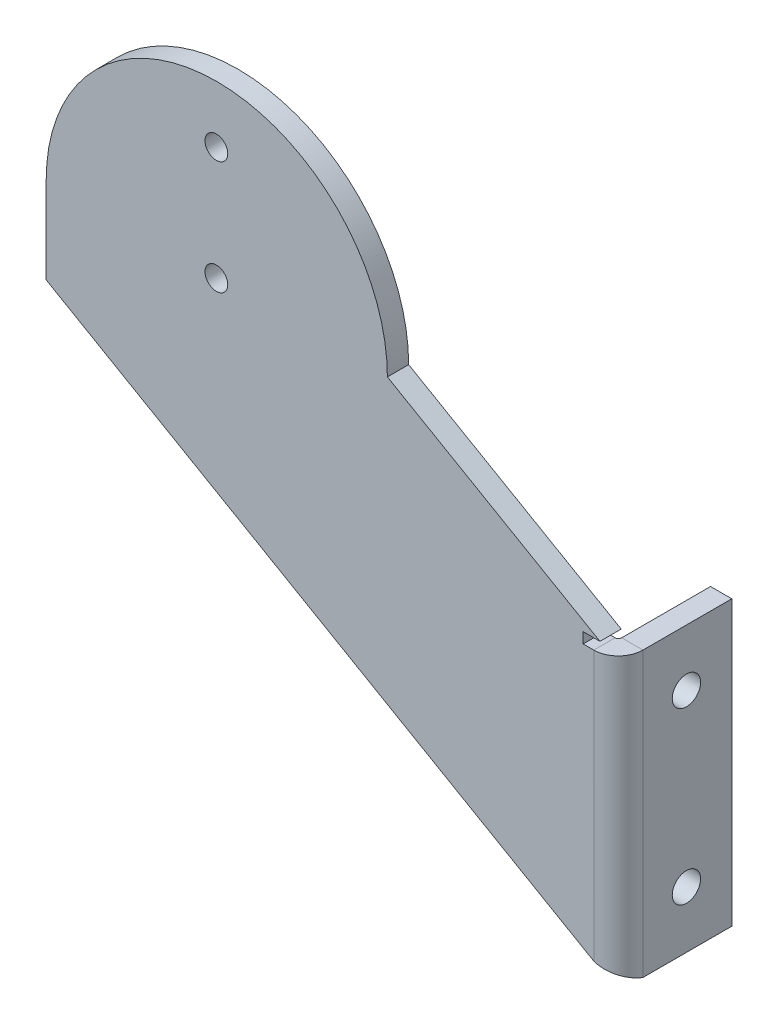
ISO-10303-21;
HEADER;
FILE_DESCRIPTION(('STEP AP214'),'2;1');
FILE_NAME('part.step','',(''),(''),'','','');
FILE_SCHEMA(('AUTOMOTIVE_DESIGN { 1 0 10303 214 1 1 1 1 }'));
ENDSEC;
DATA;
#1=APPLICATION_CONTEXT('core data for automotive mechanical design processes');
#2=APPLICATION_PROTOCOL_DEFINITION('international standard','automotive_design',2000,#1);
#3=PRODUCT_CONTEXT('',#1,'mechanical');
#4=PRODUCT('Part','Part','',(#3));
#5=PRODUCT_RELATED_PRODUCT_CATEGORY('part','',(#4));
#6=PRODUCT_DEFINITION_FORMATION('','',#4);
#7=PRODUCT_DEFINITION_CONTEXT('part definition',#1,'design');
#8=PRODUCT_DEFINITION('design','',#6,#7);
#9=PRODUCT_DEFINITION_SHAPE('','',#8);
#10=(LENGTH_UNIT() NAMED_UNIT(*) SI_UNIT(.MILLI.,.METRE.));
#11=(NAMED_UNIT(*) PLANE_ANGLE_UNIT() SI_UNIT($,.RADIAN.));
#12=(NAMED_UNIT(*) SI_UNIT($,.STERADIAN.) SOLID_ANGLE_UNIT());
#13=UNCERTAINTY_MEASURE_WITH_UNIT(LENGTH_MEASURE(1.E-05),#10,'distance_accuracy_value','');
#14=(GEOMETRIC_REPRESENTATION_CONTEXT(3) GLOBAL_UNCERTAINTY_ASSIGNED_CONTEXT((#13)) GLOBAL_UNIT_ASSIGNED_CONTEXT((#10,
#11,#12)) REPRESENTATION_CONTEXT('',''));
#15=CARTESIAN_POINT('',(0.,0.,0.));
#16=DIRECTION('',(0.,0.,1.));
#17=DIRECTION('',(1.,0.,0.));
#18=AXIS2_PLACEMENT_3D('',#15,#16,#17);
#19=CARTESIAN_POINT('',(0.,0.,-4.7625));
#20=DIRECTION('',(0.499999999999998,0.86602540378444,0.));
#21=DIRECTION('',(-0.86602540378444,0.499999999999998,0.));
#22=AXIS2_PLACEMENT_3D('',#19,#20,#21);
#23=PLANE('',#22);
#24=DIRECTION('',(-0.86602540378444,0.499999999999998,0.));
#25=VECTOR('',#24,1.);
#26=CARTESIAN_POINT('',(0.,0.,0.));
#27=LINE('',#26,#25);
#28=CARTESIAN_POINT('',(47.5931888885804,-27.4779404164144,0.));
#29=VERTEX_POINT('',#28);
#30=CARTESIAN_POINT('',(0.,0.,0.));
#31=VERTEX_POINT('',#30);
#32=EDGE_CURVE('E102',#29,#31,#27,.T.);
#33=ORIENTED_EDGE('',*,*,#32,.F.);
#34=DIRECTION('',(0.,0.,1.));
#35=VECTOR('',#34,1.);
#36=CARTESIAN_POINT('',(47.5931888885804,-27.4779404164144,-4.76250000000001));
#37=LINE('',#36,#35);
#38=CARTESIAN_POINT('',(47.5931888885804,-27.4779404164144,-4.76250000000001));
#39=VERTEX_POINT('',#38);
#40=EDGE_CURVE('E76',#39,#29,#37,.T.);
#41=ORIENTED_EDGE('',*,*,#40,.F.);
#42=DIRECTION('',(-0.86602540378444,0.499999999999998,0.));
#43=VECTOR('',#42,1.);
#44=CARTESIAN_POINT('',(0.,0.,-4.7625));
#45=LINE('',#44,#43);
#46=CARTESIAN_POINT('',(0.,0.,-4.7625));
#47=VERTEX_POINT('',#46);
#48=EDGE_CURVE('E84',#39,#47,#45,.T.);
#49=ORIENTED_EDGE('',*,*,#48,.T.);
#50=DIRECTION('',(0.,0.,1.));
#51=VECTOR('',#50,1.);
#52=CARTESIAN_POINT('',(0.,0.,-4.7625));
#53=LINE('',#52,#51);
#54=EDGE_CURVE('E301',#47,#31,#53,.T.);
#55=ORIENTED_EDGE('',*,*,#54,.T.);
#56=EDGE_LOOP('',(#33,#41,#49,#55));
#57=FACE_BOUND('',#56,.T.);
#58=ADVANCED_FACE('F61',(#57),#23,.T.);
#59=CARTESIAN_POINT('',(51.7176348741038,-93.3591904164144,-4.7625));
#60=DIRECTION('',(-0.500000000000004,-0.866025403784436,0.));
#61=DIRECTION('',(0.866025403784436,-0.500000000000004,0.));
#62=AXIS2_PLACEMENT_3D('',#59,#60,#61);
#63=PLANE('',#62);
#64=DIRECTION('',(0.866025403784436,-0.500000000000004,0.));
#65=VECTOR('',#64,1.);
#66=CARTESIAN_POINT('',(51.7176348741038,-93.3591904164144,-4.7625));
#67=LINE('',#66,#65);
#68=CARTESIAN_POINT('',(-76.3967302517925,-19.3923272239194,-4.7625));
#69=VERTEX_POINT('',#68);
#70=CARTESIAN_POINT('',(46.2185348741038,-90.1842835511137,-4.76250000000001));
#71=VERTEX_POINT('',#70);
#72=EDGE_CURVE('E338',#69,#71,#67,.T.);
#73=ORIENTED_EDGE('',*,*,#72,.T.);
#74=DIRECTION('',(0.,0.,1.));
#75=VECTOR('',#74,1.);
#76=CARTESIAN_POINT('',(46.2185348741038,-90.1842835511137,-4.76250000000001));
#77=LINE('',#76,#75);
#78=CARTESIAN_POINT('',(46.2185348741038,-90.1842835511137,0.));
#79=VERTEX_POINT('',#78);
#80=EDGE_CURVE('E213',#71,#79,#77,.T.);
#81=ORIENTED_EDGE('',*,*,#80,.T.);
#82=DIRECTION('',(0.866025403784436,-0.500000000000004,0.));
#83=VECTOR('',#82,1.);
#84=CARTESIAN_POINT('',(51.7176348741038,-93.3591904164144,0.));
#85=LINE('',#84,#83);
#86=CARTESIAN_POINT('',(-76.3967302517925,-19.3923272239194,0.));
#87=VERTEX_POINT('',#86);
#88=EDGE_CURVE('E286',#87,#79,#85,.T.);
#89=ORIENTED_EDGE('',*,*,#88,.F.);
#90=DIRECTION('',(0.,0.,1.));
#91=VECTOR('',#90,1.);
#92=CARTESIAN_POINT('',(-76.3967302517925,-19.3923272239194,-4.7625));
#93=LINE('',#92,#91);
#94=EDGE_CURVE('E283',#69,#87,#93,.T.);
#95=ORIENTED_EDGE('',*,*,#94,.F.);
#96=EDGE_LOOP('',(#73,#81,#89,#95));
#97=FACE_BOUND('',#96,.T.);
#98=ADVANCED_FACE('F259',(#97),#63,.T.);
#99=CARTESIAN_POINT('',(-38.1983651258962,0.,-4.7625));
#100=DIRECTION('',(0.,0.,1.));
#101=DIRECTION('',(1.,0.,0.));
#102=AXIS2_PLACEMENT_3D('',#99,#100,#101);
#103=PLANE('',#102);
#104=CARTESIAN_POINT('',(-38.2967302517925,25.4,-4.7625));
#105=DIRECTION('',(0.,0.,1.));
#106=DIRECTION('',(1.,0.,0.));
#107=AXIS2_PLACEMENT_3D('',#104,#105,#106);
#108=CIRCLE('',#107,2.5527);
#109=CARTESIAN_POINT('',(-35.7440302517925,25.4,-4.7625));
#110=VERTEX_POINT('',#109);
#111=EDGE_CURVE('E290',#110,#110,#108,.T.);
#112=ORIENTED_EDGE('',*,*,#111,.T.);
#113=EDGE_LOOP('',(#112));
#114=FACE_BOUND('',#113,.T.);
#115=CARTESIAN_POINT('',(-38.2967302517925,0.,-4.7625));
#116=DIRECTION('',(0.,0.,1.));
#117=DIRECTION('',(1.,0.,0.));
#118=AXIS2_PLACEMENT_3D('',#115,#116,#117);
#119=CIRCLE('',#118,2.5527);
#120=CARTESIAN_POINT('',(-35.7440302517925,0.,-4.7625));
#121=VERTEX_POINT('',#120);
#122=EDGE_CURVE('E330',#121,#121,#119,.T.);
#123=ORIENTED_EDGE('',*,*,#122,.T.);
#124=EDGE_LOOP('',(#123));
#125=FACE_BOUND('',#124,.T.);
#126=DIRECTION('',(0.,-1.,0.));
#127=VECTOR('',#126,1.);
#128=CARTESIAN_POINT('',(46.2185348741038,-93.3591904164144,-4.76250000000001));
#129=LINE('',#128,#127);
#130=CARTESIAN_POINT('',(46.2185348741038,-29.8591904164144,-4.76250000000001));
#131=VERTEX_POINT('',#130);
#132=EDGE_CURVE('E216',#71,#131,#129,.F.);
#133=ORIENTED_EDGE('',*,*,#132,.F.);
#134=ORIENTED_EDGE('',*,*,#72,.F.);
#135=DIRECTION('',(0.,-1.,0.));
#136=VECTOR('',#135,1.);
#137=CARTESIAN_POINT('',(-76.3967302517925,-19.3923272239194,-4.7625));
#138=LINE('',#137,#136);
#139=CARTESIAN_POINT('',(-76.3967302517925,0.,-4.7625));
#140=VERTEX_POINT('',#139);
#141=EDGE_CURVE('E337',#140,#69,#138,.T.);
#142=ORIENTED_EDGE('',*,*,#141,.F.);
#143=CARTESIAN_POINT('',(-38.1983651258962,0.,-4.7625));
#144=DIRECTION('',(0.,0.,1.));
#145=DIRECTION('',(1.,0.,0.));
#146=AXIS2_PLACEMENT_3D('',#143,#144,#145);
#147=CIRCLE('',#146,38.1983651258962);
#148=EDGE_CURVE('E300',#47,#140,#147,.T.);
#149=ORIENTED_EDGE('',*,*,#148,.F.);
#150=ORIENTED_EDGE('',*,*,#48,.F.);
#151=DIRECTION('',(1.,0.,0.));
#152=VECTOR('',#151,1.);
#153=CARTESIAN_POINT('',(43.8372848741038,-27.4779404164144,-4.76250000000001));
#154=LINE('',#153,#152);
#155=CARTESIAN_POINT('',(43.8372848741038,-27.4779404164144,-4.76250000000001));
#156=VERTEX_POINT('',#155);
#157=EDGE_CURVE('E323',#156,#39,#154,.T.);
#158=ORIENTED_EDGE('',*,*,#157,.F.);
#159=DIRECTION('',(0.,1.,0.));
#160=VECTOR('',#159,1.);
#161=CARTESIAN_POINT('',(43.8372848741038,-29.8591904164144,-4.76250000000001));
#162=LINE('',#161,#160);
#163=CARTESIAN_POINT('',(43.8372848741038,-29.8591904164144,-4.76250000000001));
#164=VERTEX_POINT('',#163);
#165=EDGE_CURVE('E320',#164,#156,#162,.T.);
#166=ORIENTED_EDGE('',*,*,#165,.F.);
#167=DIRECTION('',(-1.,0.,0.));
#168=VECTOR('',#167,1.);
#169=CARTESIAN_POINT('',(46.2185348741038,-29.8591904164144,-4.76250000000001));
#170=LINE('',#169,#168);
#171=EDGE_CURVE('E318',#131,#164,#170,.T.);
#172=ORIENTED_EDGE('',*,*,#171,.F.);
#173=EDGE_LOOP('',(#133,#134,#142,#149,#150,#158,#166,#172));
#174=FACE_BOUND('',#173,.T.);
#175=ADVANCED_FACE('F264',(#114,#125,#174),#103,.F.);
#176=CARTESIAN_POINT('',(-38.1983651258962,0.,0.));
#177=DIRECTION('',(0.,0.,1.));
#178=DIRECTION('',(1.,0.,0.));
#179=AXIS2_PLACEMENT_3D('',#176,#177,#178);
#180=PLANE('',#179);
#181=CARTESIAN_POINT('',(-38.2967302517925,0.,0.));
#182=DIRECTION('',(0.,0.,1.));
#183=DIRECTION('',(1.,0.,0.));
#184=AXIS2_PLACEMENT_3D('',#181,#182,#183);
#185=CIRCLE('',#184,2.5527);
#186=CARTESIAN_POINT('',(-35.7440302517925,0.,0.));
#187=VERTEX_POINT('',#186);
#188=EDGE_CURVE('E327',#187,#187,#185,.T.);
#189=ORIENTED_EDGE('',*,*,#188,.F.);
#190=EDGE_LOOP('',(#189));
#191=FACE_BOUND('',#190,.T.);
#192=CARTESIAN_POINT('',(-38.2967302517925,25.4,0.));
#193=DIRECTION('',(0.,0.,1.));
#194=DIRECTION('',(1.,0.,0.));
#195=AXIS2_PLACEMENT_3D('',#192,#193,#194);
#196=CIRCLE('',#195,2.5527);
#197=CARTESIAN_POINT('',(-35.7440302517925,25.4,0.));
#198=VERTEX_POINT('',#197);
#199=EDGE_CURVE('E293',#198,#198,#196,.T.);
#200=ORIENTED_EDGE('',*,*,#199,.F.);
#201=EDGE_LOOP('',(#200));
#202=FACE_BOUND('',#201,.T.);
#203=ORIENTED_EDGE('',*,*,#88,.T.);
#204=DIRECTION('',(0.,-1.,0.));
#205=VECTOR('',#204,1.);
#206=CARTESIAN_POINT('',(46.2185348741038,-93.3591904164144,0.));
#207=LINE('',#206,#205);
#208=CARTESIAN_POINT('',(46.2185348741038,-29.8591904164144,0.));
#209=VERTEX_POINT('',#208);
#210=EDGE_CURVE('E166',#79,#209,#207,.F.);
#211=ORIENTED_EDGE('',*,*,#210,.T.);
#212=DIRECTION('',(-1.,0.,0.));
#213=VECTOR('',#212,1.);
#214=CARTESIAN_POINT('',(-38.1983651258962,-29.8591904164144,0.));
#215=LINE('',#214,#213);
#216=CARTESIAN_POINT('',(43.8372848741038,-29.8591904164144,0.));
#217=VERTEX_POINT('',#216);
#218=EDGE_CURVE('E13',#209,#217,#215,.T.);
#219=ORIENTED_EDGE('',*,*,#218,.T.);
#220=DIRECTION('',(0.,1.,0.));
#221=VECTOR('',#220,1.);
#222=CARTESIAN_POINT('',(43.8372848741038,0.,0.));
#223=LINE('',#222,#221);
#224=CARTESIAN_POINT('',(43.8372848741038,-27.4779404164144,0.));
#225=VERTEX_POINT('',#224);
#226=EDGE_CURVE('E69',#217,#225,#223,.T.);
#227=ORIENTED_EDGE('',*,*,#226,.T.);
#228=DIRECTION('',(1.,0.,0.));
#229=VECTOR('',#228,1.);
#230=CARTESIAN_POINT('',(-38.1983651258963,-27.4779404164142,0.));
#231=LINE('',#230,#229);
#232=EDGE_CURVE('E303',#225,#29,#231,.T.);
#233=ORIENTED_EDGE('',*,*,#232,.T.);
#234=ORIENTED_EDGE('',*,*,#32,.T.);
#235=CARTESIAN_POINT('',(-38.1983651258962,0.,0.));
#236=DIRECTION('',(0.,0.,1.));
#237=DIRECTION('',(1.,0.,0.));
#238=AXIS2_PLACEMENT_3D('',#235,#236,#237);
#239=CIRCLE('',#238,38.1983651258962);
#240=CARTESIAN_POINT('',(-76.3967302517925,0.,0.));
#241=VERTEX_POINT('',#240);
#242=EDGE_CURVE('E287',#31,#241,#239,.T.);
#243=ORIENTED_EDGE('',*,*,#242,.T.);
#244=DIRECTION('',(0.,-1.,0.));
#245=VECTOR('',#244,1.);
#246=CARTESIAN_POINT('',(-76.3967302517925,-19.3923272239194,0.));
#247=LINE('',#246,#245);
#248=EDGE_CURVE('E282',#241,#87,#247,.T.);
#249=ORIENTED_EDGE('',*,*,#248,.T.);
#250=EDGE_LOOP('',(#203,#211,#219,#227,#233,#234,#243,#249));
#251=FACE_BOUND('',#250,.T.);
#252=ADVANCED_FACE('F268',(#191,#202,#251),#180,.T.);
#253=CARTESIAN_POINT('',(-38.1983651258962,0.,-4.7625));
#254=DIRECTION('',(0.,0.,1.));
#255=DIRECTION('',(1.,0.,0.));
#256=AXIS2_PLACEMENT_3D('',#253,#254,#255);
#257=CYLINDRICAL_SURFACE('',#256,38.1983651258962);
#258=ORIENTED_EDGE('',*,*,#242,.F.);
#259=ORIENTED_EDGE('',*,*,#54,.F.);
#260=ORIENTED_EDGE('',*,*,#148,.T.);
#261=DIRECTION('',(0.,0.,1.));
#262=VECTOR('',#261,1.);
#263=CARTESIAN_POINT('',(-76.3967302517925,0.,-4.7625));
#264=LINE('',#263,#262);
#265=EDGE_CURVE('E107',#140,#241,#264,.T.);
#266=ORIENTED_EDGE('',*,*,#265,.T.);
#267=EDGE_LOOP('',(#258,#259,#260,#266));
#268=FACE_BOUND('',#267,.T.);
#269=ADVANCED_FACE('F63',(#268),#257,.T.);
#270=CARTESIAN_POINT('',(-76.3967302517925,-19.3923272239194,-4.7625));
#271=DIRECTION('',(-1.,0.,0.));
#272=DIRECTION('',(0.,0.,1.));
#273=AXIS2_PLACEMENT_3D('',#270,#271,#272);
#274=PLANE('',#273);
#275=ORIENTED_EDGE('',*,*,#248,.F.);
#276=ORIENTED_EDGE('',*,*,#265,.F.);
#277=ORIENTED_EDGE('',*,*,#141,.T.);
#278=ORIENTED_EDGE('',*,*,#94,.T.);
#279=EDGE_LOOP('',(#275,#276,#277,#278));
#280=FACE_BOUND('',#279,.T.);
#281=ADVANCED_FACE('F270',(#280),#274,.T.);
#282=CARTESIAN_POINT('',(-38.2967302517925,25.4,0.));
#283=DIRECTION('',(0.,0.,1.));
#284=DIRECTION('',(1.,0.,0.));
#285=AXIS2_PLACEMENT_3D('',#282,#283,#284);
#286=CYLINDRICAL_SURFACE('',#285,2.5527);
#287=ORIENTED_EDGE('',*,*,#111,.F.);
#288=EDGE_LOOP('',(#287));
#289=FACE_BOUND('',#288,.T.);
#290=ORIENTED_EDGE('',*,*,#199,.T.);
#291=EDGE_LOOP('',(#290));
#292=FACE_BOUND('',#291,.T.);
#293=ADVANCED_FACE('F272',(#289,#292),#286,.F.);
#294=CARTESIAN_POINT('',(-38.2967302517925,0.,0.));
#295=DIRECTION('',(0.,0.,1.));
#296=DIRECTION('',(1.,0.,0.));
#297=AXIS2_PLACEMENT_3D('',#294,#295,#296);
#298=CYLINDRICAL_SURFACE('',#297,2.5527);
#299=ORIENTED_EDGE('',*,*,#122,.F.);
#300=EDGE_LOOP('',(#299));
#301=FACE_BOUND('',#300,.T.);
#302=ORIENTED_EDGE('',*,*,#188,.T.);
#303=EDGE_LOOP('',(#302));
#304=FACE_BOUND('',#303,.T.);
#305=ADVANCED_FACE('F277',(#301,#304),#298,.F.);
#306=CARTESIAN_POINT('',(46.2185348741038,-29.8591904164144,-4.76250000000001));
#307=DIRECTION('',(0.,1.,0.));
#308=DIRECTION('',(0.,0.,1.));
#309=AXIS2_PLACEMENT_3D('',#306,#307,#308);
#310=PLANE('',#309);
#311=ORIENTED_EDGE('',*,*,#218,.F.);
#312=DIRECTION('',(0.,0.,1.));
#313=VECTOR('',#312,1.);
#314=CARTESIAN_POINT('',(46.2185348741038,-29.8591904164144,-4.76250000000001));
#315=LINE('',#314,#313);
#316=EDGE_CURVE('E219',#131,#209,#315,.T.);
#317=ORIENTED_EDGE('',*,*,#316,.F.);
#318=ORIENTED_EDGE('',*,*,#171,.T.);
#319=DIRECTION('',(0.,0.,1.));
#320=VECTOR('',#319,1.);
#321=CARTESIAN_POINT('',(43.8372848741038,-29.8591904164144,-4.76250000000001));
#322=LINE('',#321,#320);
#323=EDGE_CURVE('E312',#164,#217,#322,.T.);
#324=ORIENTED_EDGE('',*,*,#323,.T.);
#325=EDGE_LOOP('',(#311,#317,#318,#324));
#326=FACE_BOUND('',#325,.T.);
#327=ADVANCED_FACE('F315',(#326),#310,.T.);
#328=CARTESIAN_POINT('',(43.8372848741038,-29.8591904164144,-4.76250000000001));
#329=DIRECTION('',(1.,0.,0.));
#330=DIRECTION('',(0.,0.,-1.));
#331=AXIS2_PLACEMENT_3D('',#328,#329,#330);
#332=PLANE('',#331);
#333=ORIENTED_EDGE('',*,*,#226,.F.);
#334=ORIENTED_EDGE('',*,*,#323,.F.);
#335=ORIENTED_EDGE('',*,*,#165,.T.);
#336=DIRECTION('',(0.,0.,1.));
#337=VECTOR('',#336,1.);
#338=CARTESIAN_POINT('',(43.8372848741038,-27.4779404164144,-4.76250000000001));
#339=LINE('',#338,#337);
#340=EDGE_CURVE('E222',#156,#225,#339,.T.);
#341=ORIENTED_EDGE('',*,*,#340,.T.);
#342=EDGE_LOOP('',(#333,#334,#335,#341));
#343=FACE_BOUND('',#342,.T.);
#344=ADVANCED_FACE('F257',(#343),#332,.T.);
#345=CARTESIAN_POINT('',(43.8372848741038,-27.4779404164144,-4.76250000000001));
#346=DIRECTION('',(0.,-1.,0.));
#347=DIRECTION('',(1.,0.,0.));
#348=AXIS2_PLACEMENT_3D('',#345,#346,#347);
#349=PLANE('',#348);
#350=ORIENTED_EDGE('',*,*,#232,.F.);
#351=ORIENTED_EDGE('',*,*,#340,.F.);
#352=ORIENTED_EDGE('',*,*,#157,.T.);
#353=ORIENTED_EDGE('',*,*,#40,.T.);
#354=EDGE_LOOP('',(#350,#351,#352,#353));
#355=FACE_BOUND('',#354,.T.);
#356=ADVANCED_FACE('F251',(#355),#349,.T.);
#357=CARTESIAN_POINT('',(46.2185348741038,-29.8591904164144,-5.4991));
#358=DIRECTION('',(0.,1.,0.));
#359=DIRECTION('',(0.,0.,1.));
#360=AXIS2_PLACEMENT_3D('',#357,#358,#359);
#361=PLANE('',#360);
#362=DIRECTION('',(-1.,0.,0.));
#363=VECTOR('',#362,1.);
#364=CARTESIAN_POINT('',(51.7176348741038,-29.8591904164144,-5.49909999999999));
#365=LINE('',#364,#363);
#366=CARTESIAN_POINT('',(46.9551348741038,-29.8591904164144,-5.4991));
#367=VERTEX_POINT('',#366);
#368=CARTESIAN_POINT('',(51.7176348741038,-29.8591904164144,-5.49909999999998));
#369=VERTEX_POINT('',#368);
#370=EDGE_CURVE('E207',#367,#369,#365,.F.);
#371=ORIENTED_EDGE('',*,*,#370,.F.);
#372=CARTESIAN_POINT('',(46.2185348741038,-29.8591904164144,-5.4991));
#373=DIRECTION('',(0.,-1.,0.));
#374=DIRECTION('',(0.,0.,-1.));
#375=AXIS2_PLACEMENT_3D('',#372,#373,#374);
#376=CIRCLE('',#375,0.73659999999999);
#377=EDGE_CURVE('E169',#131,#367,#376,.F.);
#378=ORIENTED_EDGE('',*,*,#377,.F.);
#379=ORIENTED_EDGE('',*,*,#316,.T.);
#380=CARTESIAN_POINT('',(46.2185348741038,-29.8591904164144,-5.4991));
#381=DIRECTION('',(0.,-1.,0.));
#382=DIRECTION('',(0.,0.,-1.));
#383=AXIS2_PLACEMENT_3D('',#380,#381,#382);
#384=CIRCLE('',#383,5.49909999999999);
#385=EDGE_CURVE('E211',#209,#369,#384,.F.);
#386=ORIENTED_EDGE('',*,*,#385,.T.);
#387=EDGE_LOOP('',(#371,#378,#379,#386));
#388=FACE_BOUND('',#387,.T.);
#389=ADVANCED_FACE('F249',(#388),#361,.T.);
#390=CARTESIAN_POINT('',(51.7652598741038,-93.3591904164144,-5.49909999999998));
#391=CARTESIAN_POINT('',(51.7652598741038,-93.0945724550795,-4.77291993524798));
#392=CARTESIAN_POINT('',(51.6208934690968,-92.8300392721976,-4.04725646612727));
#393=CARTESIAN_POINT('',(51.065187679048,-92.3008881279808,-2.70566401110223));
#394=CARTESIAN_POINT('',(50.6540669405048,-92.0363125558724,-2.09037834464716));
#395=CARTESIAN_POINT('',(49.6272565294566,-91.5071614116556,-1.06356793359898));
#396=CARTESIAN_POINT('',(49.0119708630016,-91.2425858395473,-0.652447195055761));
#397=CARTESIAN_POINT('',(47.6703784079765,-90.7134346953305,-0.0967414050069637));
#398=CARTESIAN_POINT('',(46.9447149388558,-90.4489015124486,0.047624999999981));
#399=CARTESIAN_POINT('',(46.2185348741038,-90.1842835511137,0.0476249999999879));
#400=CARTESIAN_POINT('',(51.7176348741038,-93.3591904164144,-5.49909999999998));
#401=CARTESIAN_POINT('',(51.7176348741038,-93.0945728194015,-4.77915515615932));
#402=CARTESIAN_POINT('',(51.5745080203705,-92.8300392721976,-4.05972220911988));
#403=CARTESIAN_POINT('',(51.0235736023027,-92.3008881279808,-2.72964886504239));
#404=CARTESIAN_POINT('',(50.6159828071356,-92.0363125558724,-2.11964613218596));
#405=CARTESIAN_POINT('',(49.5979887419178,-91.5071614116556,-1.10165206696819));
#406=CARTESIAN_POINT('',(48.9879860090614,-91.2425858395473,-0.694061271801132));
#407=CARTESIAN_POINT('',(47.6579126649839,-90.7134346953305,-0.143126853733292));
#408=CARTESIAN_POINT('',(46.9384797179445,-90.4489011481266,0.));
#409=CARTESIAN_POINT('',(46.2185348741038,-90.1842835511137,0.));
#410=CARTESIAN_POINT('',(46.9551348741038,-93.3591904164144,-5.4991));
#411=CARTESIAN_POINT('',(46.9551348741038,-93.0946092516022,-5.40267724729412));
#412=CARTESIAN_POINT('',(46.9359631477376,-92.8300392721976,-5.30629650838096));
#413=CARTESIAN_POINT('',(46.8621659277655,-92.3008881279808,-5.1281342590588));
#414=CARTESIAN_POINT('',(46.8075694702143,-92.0363125558724,-5.04642488606649));
#415=CARTESIAN_POINT('',(46.6712099880373,-91.5071614116556,-4.91006540388951));
#416=CARTESIAN_POINT('',(46.589500615045,-91.2425858395473,-4.85546894633827));
#417=CARTESIAN_POINT('',(46.4113383657228,-90.7134346953305,-4.78167172636613));
#418=CARTESIAN_POINT('',(46.3149576268097,-90.4488647159259,-4.76250000000001));
#419=CARTESIAN_POINT('',(46.2185348741038,-90.1842835511137,-4.76250000000001));
#420=CARTESIAN_POINT('',(46.9070336241038,-93.3591904164144,-5.4991));
#421=CARTESIAN_POINT('',(46.9070336241038,-93.0946096195674,-5.40897482041458));
#422=CARTESIAN_POINT('',(46.8891138445241,-92.8300392721976,-5.3188869088035));
#423=CARTESIAN_POINT('',(46.8201357102527,-92.3008881279808,-5.15235896153837));
#424=CARTESIAN_POINT('',(46.7691044955114,-92.0363125558724,-5.07598535148068));
#425=CARTESIAN_POINT('',(46.6416495226231,-91.5071614116556,-4.94853037859242));
#426=CARTESIAN_POINT('',(46.5652759125654,-91.2425858395473,-4.89749916385109));
#427=CARTESIAN_POINT('',(46.3987479653003,-90.7134346953305,-4.82852102957972));
#428=CARTESIAN_POINT('',(46.3086600536892,-90.4488643479607,-4.81060125000001));
#429=CARTESIAN_POINT('',(46.2185348741038,-90.1842835511137,-4.81060125000001));
#430=B_SPLINE_SURFACE_WITH_KNOTS('',1,3,((#390,#391,#392,#393,#394,#395,#396,#397,#398,#399),
(#400,#401,#402,#403,#404,#405,#406,#407,#408,#409),(#410,#411,#412,#413,#414,#415,#416,#417,
#418,#419),(#420,#421,#422,#423,#424,#425,#426,#427,#428,#429)),.UNSPECIFIED.,.F.,.F.,.F.,(2,1,
1,2),(4,2,2,2,4),(-0.01,0.,1.,1.0101),(0.,0.25,0.5,0.75,1.),.UNSPECIFIED.);
#431=CARTESIAN_POINT('',(46.9551348741038,-93.3591904164144,-5.4991));
#432=CARTESIAN_POINT('',(46.9551742841149,-93.242640938276,-5.45662098982252));
#433=CARTESIAN_POINT('',(46.9514627100518,-93.1260928594509,-5.41415138640345));
#434=CARTESIAN_POINT('',(46.9368190925889,-92.8929903077109,-5.33047059549351));
#435=CARTESIAN_POINT('',(46.9258866358114,-92.7764358348119,-5.28925948018926));
#436=CARTESIAN_POINT('',(46.8971177852329,-92.5436076896771,-5.2094374537906));
#437=CARTESIAN_POINT('',(46.87929822136,-92.4273340228789,-5.17082047140903));
#438=CARTESIAN_POINT('',(46.8372980299475,-92.1948143825938,-5.0972218962019));
#439=CARTESIAN_POINT('',(46.8131185814619,-92.0785684079672,-5.06223963121414));
#440=CARTESIAN_POINT('',(46.7520663249391,-91.8157502733445,-4.98843977667917));
#441=CARTESIAN_POINT('',(46.713527701547,-91.6691728175563,-4.95099993752641));
#442=CARTESIAN_POINT('',(46.6292860588606,-91.3760703783286,-4.8853282864216));
#443=CARTESIAN_POINT('',(46.5835849353406,-91.2295453912583,-4.85709404400128));
#444=CARTESIAN_POINT('',(46.486117874067,-90.9332907537118,-4.81065681573479));
#445=CARTESIAN_POINT('',(46.4342417655512,-90.7835606245758,-4.79268503648684));
#446=CARTESIAN_POINT('',(46.3543946423234,-90.5589281473938,-4.77462112477924));
#447=CARTESIAN_POINT('',(46.3274242393628,-90.4840019510827,-4.77008206721029));
#448=CARTESIAN_POINT('',(46.2731477541238,-90.3341478563742,-4.76401914656467));
#449=CARTESIAN_POINT('',(46.2458416666212,-90.2592199579684,-4.76249533047421));
#450=CARTESIAN_POINT('',(46.2185348741038,-90.1842835511137,-4.76250000000001));
#451=B_SPLINE_CURVE_WITH_KNOTS('',3,(#431,#432,#433,#434,#435,#436,#437,#438,#439,#440,#441,
#442,#443,#444,#445,#446,#447,#448,#449,#450),.UNSPECIFIED.,.F.,.F.,(4,2,2,2,2,2,2,2,2,4),(0.,
0.372085991624273,0.744193286089361,1.1153969585458,1.4865318622905,1.95442337994525,
2.42219126432299,2.90011939807591,3.1393548883346,3.37859410654713),.UNSPECIFIED.);
#452=CARTESIAN_POINT('',(46.9551348741038,-93.3591904164144,-5.4991));
#453=VERTEX_POINT('',#452);
#454=EDGE_CURVE('E176',#453,#71,#451,.T.);
#455=DIRECTION('',(-1.,0.,0.));
#456=VECTOR('',#455,1.);
#457=CARTESIAN_POINT('',(46.9551348741038,-93.3591904164144,-5.4991));
#458=LINE('',#457,#456);
#459=CARTESIAN_POINT('',(51.7176348741038,-93.3591904164144,-5.49909999999998));
#460=VERTEX_POINT('',#459);
#461=EDGE_CURVE('E173',#453,#460,#458,.F.);
#462=CARTESIAN_POINT('',(51.7176348741038,-93.3591904164144,-5.49909999999998));
#463=CARTESIAN_POINT('',(51.7176717679547,-93.2900110404525,-5.31089492161635));
#464=CARTESIAN_POINT('',(51.7079747329104,-93.2208350588123,-5.12269375538506));
#465=CARTESIAN_POINT('',(51.6693748285333,-93.0824838261664,-4.74826144444313));
#466=CARTESIAN_POINT('',(51.6404711910946,-93.0133085753006,-4.5620303788229));
#467=CARTESIAN_POINT('',(51.5638073022178,-92.8751153884342,-4.1939343171045));
#468=CARTESIAN_POINT('',(51.5160900266396,-92.8060974519671,-4.01206036550401));
#469=CARTESIAN_POINT('',(51.4023146287425,-92.6680663091498,-3.65416997540568));
#470=CARTESIAN_POINT('',(51.3362596174904,-92.5990531039817,-3.47815254899342));
#471=CARTESIAN_POINT('',(51.1956386858455,-92.4694474379118,-3.15480288763195));
#472=CARTESIAN_POINT('',(51.123091106882,-92.4088537620036,-3.00658907937439));
#473=CARTESIAN_POINT('',(50.9649769019022,-92.2876709348723,-2.71727344425037));
#474=CARTESIAN_POINT('',(50.8794106957549,-92.2270817835662,-2.5761713882152));
#475=CARTESIAN_POINT('',(50.6960014996453,-92.1059367814909,-2.30229817947179));
#476=CARTESIAN_POINT('',(50.5981651683037,-92.045380930418,-2.16952256643995));
#477=CARTESIAN_POINT('',(50.3909687224906,-91.9242633457066,-1.9132886418086));
#478=CARTESIAN_POINT('',(50.2816084542203,-91.8637016120002,-1.78983045459755));
#479=CARTESIAN_POINT('',(50.0522687808787,-91.7425905014547,-1.55325133887399));
#480=CARTESIAN_POINT('',(49.9322913843627,-91.682041124441,-1.4401284633155));
#481=CARTESIAN_POINT('',(49.6826676160834,-91.5609440426589,-1.22510633079306));
#482=CARTESIAN_POINT('',(49.5530212334568,-91.5003963378925,-1.12320708643948));
#483=CARTESIAN_POINT('',(49.2850164051473,-91.3792644581011,-0.931391104574665));
#484=CARTESIAN_POINT('',(49.1466522449485,-91.3186802854878,-0.84148234973984));
#485=CARTESIAN_POINT('',(48.8624150531927,-91.1975086633569,-0.674458080750358));
#486=CARTESIAN_POINT('',(48.7165422776113,-91.1369212140213,-0.597342130855321));
#487=CARTESIAN_POINT('',(48.4183607172226,-91.0157057934804,-0.45647422612086));
#488=CARTESIAN_POINT('',(48.2660476622765,-90.9550778224772,-0.392731310484049));
#489=CARTESIAN_POINT('',(47.9563126670348,-90.8338226841669,-0.279192571925386));
#490=CARTESIAN_POINT('',(47.7988908802553,-90.7731955168903,-0.229396330341599));
#491=CARTESIAN_POINT('',(47.4804745329552,-90.6520478802069,-0.144220917794823));
#492=CARTESIAN_POINT('',(47.3194862329028,-90.5915273983778,-0.108818314456981));
#493=CARTESIAN_POINT('',(46.9950504990628,-90.4705091286502,-0.0526145945343398));
#494=CARTESIAN_POINT('',(46.8316044855159,-90.4100113468969,-0.0318053528322758));
#495=CARTESIAN_POINT('',(46.5928659791814,-90.3219662378781,-0.0122424303553671));
#496=CARTESIAN_POINT('',(46.5180165300159,-90.2944079648798,-0.00764891939442473));
#497=CARTESIAN_POINT('',(46.3682926474381,-90.2393285285474,-0.00152986890260512));
#498=CARTESIAN_POINT('',(46.2934183816947,-90.2118073649358,-2.29381066068034E-07));
#499=CARTESIAN_POINT('',(46.2185348741038,-90.1842835511137,0.));
#500=B_SPLINE_CURVE_WITH_KNOTS('',3,(#462,#463,#464,#465,#466,#467,#468,#469,#470,#471,#472,
#473,#474,#475,#476,#477,#478,#479,#480,#481,#482,#483,#484,#485,#486,#487,#488,#489,#490,#491,
#492,#493,#494,#495,#496,#497,#498,#499),.UNSPECIFIED.,.F.,.F.,(4,2,2,2,2,2,2,2,2,2,2,2,2,2,2,2,
2,2,4),(0.,0.601309558772443,1.20264316642028,1.80261103711314,2.40247718310394,
2.92923646479417,3.45597876135623,3.98243643795469,4.50890114156703,5.03526646029395,
5.56163237041491,6.08834697803117,6.61504364134444,7.14209517455176,7.66913088462655,
8.19530512865287,8.72118618259617,8.96081798325777,9.20012890025643),.UNSPECIFIED.);
#501=EDGE_CURVE('E159',#460,#79,#500,.T.);
#502=ORIENTED_EDGE('',*,*,#454,.F.);
#503=ORIENTED_EDGE('',*,*,#461,.T.);
#504=ORIENTED_EDGE('',*,*,#501,.T.);
#505=ORIENTED_EDGE('',*,*,#80,.F.);
#506=EDGE_LOOP('',(#502,#503,#504,#505));
#507=FACE_BOUND('',#506,.T.);
#508=ADVANCED_FACE('F174',(#507),#430,.F.);
#509=CARTESIAN_POINT('',(46.2185348741038,-93.3591904164144,-5.4991));
#510=DIRECTION('',(0.,-1.,0.));
#511=DIRECTION('',(1.,0.,0.));
#512=AXIS2_PLACEMENT_3D('',#509,#510,#511);
#513=CYLINDRICAL_SURFACE('',#512,5.49909999999999);
#514=ORIENTED_EDGE('',*,*,#210,.F.);
#515=ORIENTED_EDGE('',*,*,#501,.F.);
#516=DIRECTION('',(0.,-1.,0.));
#517=VECTOR('',#516,1.);
#518=CARTESIAN_POINT('',(51.7176348741038,0.,-5.49909999999998));
#519=LINE('',#518,#517);
#520=EDGE_CURVE('E163',#369,#460,#519,.T.);
#521=ORIENTED_EDGE('',*,*,#520,.F.);
#522=ORIENTED_EDGE('',*,*,#385,.F.);
#523=EDGE_LOOP('',(#514,#515,#521,#522));
#524=FACE_BOUND('',#523,.T.);
#525=ADVANCED_FACE('F161',(#524),#513,.T.);
#526=CARTESIAN_POINT('',(46.2185348741038,-93.3591904164144,-5.4991));
#527=DIRECTION('',(0.,-1.,0.));
#528=DIRECTION('',(1.,0.,0.));
#529=AXIS2_PLACEMENT_3D('',#526,#527,#528);
#530=CYLINDRICAL_SURFACE('',#529,0.73659999999999);
#531=ORIENTED_EDGE('',*,*,#132,.T.);
#532=ORIENTED_EDGE('',*,*,#377,.T.);
#533=DIRECTION('',(0.,1.,0.));
#534=VECTOR('',#533,1.);
#535=CARTESIAN_POINT('',(46.9551348741038,-29.8591904164144,-5.4991));
#536=LINE('',#535,#534);
#537=EDGE_CURVE('E180',#367,#453,#536,.F.);
#538=ORIENTED_EDGE('',*,*,#537,.T.);
#539=ORIENTED_EDGE('',*,*,#454,.T.);
#540=EDGE_LOOP('',(#531,#532,#538,#539));
#541=FACE_BOUND('',#540,.T.);
#542=ADVANCED_FACE('F244',(#541),#530,.F.);
#543=CARTESIAN_POINT('',(51.7176348741038,-93.3591904164144,-4.76249999999998));
#544=DIRECTION('',(0.,1.,0.));
#545=DIRECTION('',(-1.,0.,0.));
#546=AXIS2_PLACEMENT_3D('',#543,#544,#545);
#547=PLANE('',#546);
#548=ORIENTED_EDGE('',*,*,#461,.F.);
#549=DIRECTION('',(0.,0.,-1.));
#550=VECTOR('',#549,1.);
#551=CARTESIAN_POINT('',(46.9551348741038,-93.3591904164144,-4.7625));
#552=LINE('',#551,#550);
#553=CARTESIAN_POINT('',(46.9551348741038,-93.3591904164144,-25.4));
#554=VERTEX_POINT('',#553);
#555=EDGE_CURVE('E189',#453,#554,#552,.T.);
#556=ORIENTED_EDGE('',*,*,#555,.T.);
#557=DIRECTION('',(-1.,0.,0.));
#558=VECTOR('',#557,1.);
#559=CARTESIAN_POINT('',(51.7176348741039,-93.3591904164144,-25.4));
#560=LINE('',#559,#558);
#561=CARTESIAN_POINT('',(51.7176348741039,-93.3591904164144,-25.4));
#562=VERTEX_POINT('',#561);
#563=EDGE_CURVE('E193',#562,#554,#560,.T.);
#564=ORIENTED_EDGE('',*,*,#563,.F.);
#565=DIRECTION('',(0.,0.,1.));
#566=VECTOR('',#565,1.);
#567=CARTESIAN_POINT('',(51.7176348741038,-93.3591904164144,1.90517062421325E-13));
#568=LINE('',#567,#566);
#569=EDGE_CURVE('E185',#460,#562,#568,.F.);
#570=ORIENTED_EDGE('',*,*,#569,.F.);
#571=EDGE_LOOP('',(#548,#556,#564,#570));
#572=FACE_BOUND('',#571,.T.);
#573=ADVANCED_FACE('F191',(#572),#547,.F.);
#574=CARTESIAN_POINT('',(51.7176348741038,-29.8591904164144,-25.4));
#575=DIRECTION('',(0.,-1.,0.));
#576=DIRECTION('',(1.,0.,0.));
#577=AXIS2_PLACEMENT_3D('',#574,#575,#576);
#578=PLANE('',#577);
#579=ORIENTED_EDGE('',*,*,#370,.T.);
#580=DIRECTION('',(0.,0.,-1.));
#581=VECTOR('',#580,1.);
#582=CARTESIAN_POINT('',(51.7176348741038,-29.8591904164144,1.90517062421325E-13));
#583=LINE('',#582,#581);
#584=CARTESIAN_POINT('',(51.7176348741038,-29.8591904164144,-25.4));
#585=VERTEX_POINT('',#584);
#586=EDGE_CURVE('E188',#585,#369,#583,.F.);
#587=ORIENTED_EDGE('',*,*,#586,.F.);
#588=DIRECTION('',(-1.,0.,0.));
#589=VECTOR('',#588,1.);
#590=CARTESIAN_POINT('',(51.7176348741038,-29.8591904164144,-25.4));
#591=LINE('',#590,#589);
#592=CARTESIAN_POINT('',(46.9551348741038,-29.8591904164144,-25.4));
#593=VERTEX_POINT('',#592);
#594=EDGE_CURVE('E351',#585,#593,#591,.T.);
#595=ORIENTED_EDGE('',*,*,#594,.T.);
#596=DIRECTION('',(0.,0.,1.));
#597=VECTOR('',#596,1.);
#598=CARTESIAN_POINT('',(46.9551348741038,-29.8591904164144,-25.4));
#599=LINE('',#598,#597);
#600=EDGE_CURVE('E196',#593,#367,#599,.T.);
#601=ORIENTED_EDGE('',*,*,#600,.T.);
#602=EDGE_LOOP('',(#579,#587,#595,#601));
#603=FACE_BOUND('',#602,.T.);
#604=ADVANCED_FACE('F347',(#603),#578,.F.);
#605=CARTESIAN_POINT('',(51.7176348741037,0.,1.90517062421325E-13));
#606=DIRECTION('',(1.,0.,0.));
#607=DIRECTION('',(0.,0.,-1.));
#608=AXIS2_PLACEMENT_3D('',#605,#606,#607);
#609=PLANE('',#608);
#610=CARTESIAN_POINT('',(51.7176348741039,-80.6591904164144,-15.24));
#611=DIRECTION('',(-1.,0.,0.));
#612=DIRECTION('',(0.,0.,1.));
#613=AXIS2_PLACEMENT_3D('',#610,#611,#612);
#614=CIRCLE('',#613,3.175);
#615=CARTESIAN_POINT('',(51.7176348741039,-80.6591904164144,-12.065));
#616=VERTEX_POINT('',#615);
#617=EDGE_CURVE('E365',#616,#616,#614,.T.);
#618=ORIENTED_EDGE('',*,*,#617,.T.);
#619=EDGE_LOOP('',(#618));
#620=FACE_BOUND('',#619,.T.);
#621=CARTESIAN_POINT('',(51.7176348741039,-42.5591904164144,-15.24));
#622=DIRECTION('',(-1.,0.,0.));
#623=DIRECTION('',(0.,0.,1.));
#624=AXIS2_PLACEMENT_3D('',#621,#622,#623);
#625=CIRCLE('',#624,3.175);
#626=CARTESIAN_POINT('',(51.7176348741039,-42.5591904164144,-12.065));
#627=VERTEX_POINT('',#626);
#628=EDGE_CURVE('E210',#627,#627,#625,.T.);
#629=ORIENTED_EDGE('',*,*,#628,.T.);
#630=EDGE_LOOP('',(#629));
#631=FACE_BOUND('',#630,.T.);
#632=ORIENTED_EDGE('',*,*,#586,.T.);
#633=ORIENTED_EDGE('',*,*,#520,.T.);
#634=ORIENTED_EDGE('',*,*,#569,.T.);
#635=DIRECTION('',(0.,-1.,0.));
#636=VECTOR('',#635,1.);
#637=CARTESIAN_POINT('',(51.7176348741038,0.,-25.4));
#638=LINE('',#637,#636);
#639=EDGE_CURVE('E195',#562,#585,#638,.F.);
#640=ORIENTED_EDGE('',*,*,#639,.T.);
#641=EDGE_LOOP('',(#632,#633,#634,#640));
#642=FACE_BOUND('',#641,.T.);
#643=ADVANCED_FACE('F184',(#620,#631,#642),#609,.T.);
#644=CARTESIAN_POINT('',(46.9551348741037,0.,1.73888882545084E-13));
#645=DIRECTION('',(1.,0.,0.));
#646=DIRECTION('',(0.,0.,-1.));
#647=AXIS2_PLACEMENT_3D('',#644,#645,#646);
#648=PLANE('',#647);
#649=CARTESIAN_POINT('',(46.9551348741037,-80.6591904164144,-15.24));
#650=DIRECTION('',(-1.,0.,0.));
#651=DIRECTION('',(0.,0.,1.));
#652=AXIS2_PLACEMENT_3D('',#649,#650,#651);
#653=CIRCLE('',#652,3.17499999999998);
#654=CARTESIAN_POINT('',(46.9551348741037,-80.6591904164144,-12.065));
#655=VERTEX_POINT('',#654);
#656=EDGE_CURVE('E368',#655,#655,#653,.T.);
#657=ORIENTED_EDGE('',*,*,#656,.F.);
#658=EDGE_LOOP('',(#657));
#659=FACE_BOUND('',#658,.T.);
#660=CARTESIAN_POINT('',(46.9551348741037,-42.5591904164144,-15.24));
#661=DIRECTION('',(-1.,0.,0.));
#662=DIRECTION('',(0.,0.,1.));
#663=AXIS2_PLACEMENT_3D('',#660,#661,#662);
#664=CIRCLE('',#663,3.17499999999999);
#665=CARTESIAN_POINT('',(46.9551348741037,-42.5591904164144,-12.065));
#666=VERTEX_POINT('',#665);
#667=EDGE_CURVE('E362',#666,#666,#664,.T.);
#668=ORIENTED_EDGE('',*,*,#667,.F.);
#669=EDGE_LOOP('',(#668));
#670=FACE_BOUND('',#669,.T.);
#671=ORIENTED_EDGE('',*,*,#537,.F.);
#672=ORIENTED_EDGE('',*,*,#600,.F.);
#673=DIRECTION('',(0.,1.,0.));
#674=VECTOR('',#673,1.);
#675=CARTESIAN_POINT('',(46.9551348741038,-29.8591904164144,-25.4));
#676=LINE('',#675,#674);
#677=EDGE_CURVE('E200',#554,#593,#676,.T.);
#678=ORIENTED_EDGE('',*,*,#677,.F.);
#679=ORIENTED_EDGE('',*,*,#555,.F.);
#680=EDGE_LOOP('',(#671,#672,#678,#679));
#681=FACE_BOUND('',#680,.T.);
#682=ADVANCED_FACE('F354',(#659,#670,#681),#648,.F.);
#683=CARTESIAN_POINT('',(51.7176348741038,-29.8591904164144,-25.4));
#684=DIRECTION('',(0.,0.,1.));
#685=DIRECTION('',(1.,0.,0.));
#686=AXIS2_PLACEMENT_3D('',#683,#684,#685);
#687=PLANE('',#686);
#688=ORIENTED_EDGE('',*,*,#677,.T.);
#689=ORIENTED_EDGE('',*,*,#594,.F.);
#690=ORIENTED_EDGE('',*,*,#639,.F.);
#691=ORIENTED_EDGE('',*,*,#563,.T.);
#692=EDGE_LOOP('',(#688,#689,#690,#691));
#693=FACE_BOUND('',#692,.T.);
#694=ADVANCED_FACE('F356',(#693),#687,.F.);
#695=CARTESIAN_POINT('',(46.9551348741037,-42.5591904164144,-15.24));
#696=DIRECTION('',(-1.,0.,0.));
#697=DIRECTION('',(0.,0.,1.));
#698=AXIS2_PLACEMENT_3D('',#695,#696,#697);
#699=CYLINDRICAL_SURFACE('',#698,3.17499999999999);
#700=ORIENTED_EDGE('',*,*,#628,.F.);
#701=EDGE_LOOP('',(#700));
#702=FACE_BOUND('',#701,.T.);
#703=ORIENTED_EDGE('',*,*,#667,.T.);
#704=EDGE_LOOP('',(#703));
#705=FACE_BOUND('',#704,.T.);
#706=ADVANCED_FACE('F379',(#702,#705),#699,.F.);
#707=CARTESIAN_POINT('',(46.9551348741037,-80.6591904164144,-15.24));
#708=DIRECTION('',(-1.,0.,0.));
#709=DIRECTION('',(0.,0.,1.));
#710=AXIS2_PLACEMENT_3D('',#707,#708,#709);
#711=CYLINDRICAL_SURFACE('',#710,3.17499999999999);
#712=ORIENTED_EDGE('',*,*,#617,.F.);
#713=EDGE_LOOP('',(#712));
#714=FACE_BOUND('',#713,.T.);
#715=ORIENTED_EDGE('',*,*,#656,.T.);
#716=EDGE_LOOP('',(#715));
#717=FACE_BOUND('',#716,.T.);
#718=ADVANCED_FACE('F372',(#714,#717),#711,.F.);
#719=CLOSED_SHELL('',(#58,#98,#175,#252,#269,#281,#293,#305,#327,#344,#356,#389,#508,#525,#542,
#573,#604,#643,#682,#694,#706,#718));
#720=MANIFOLD_SOLID_BREP('B2',#719);
#721=ADVANCED_BREP_SHAPE_REPRESENTATION('',(#18,#720),#14);
#722=SHAPE_DEFINITION_REPRESENTATION(#9,#721);
ENDSEC;
END-ISO-10303-21;
